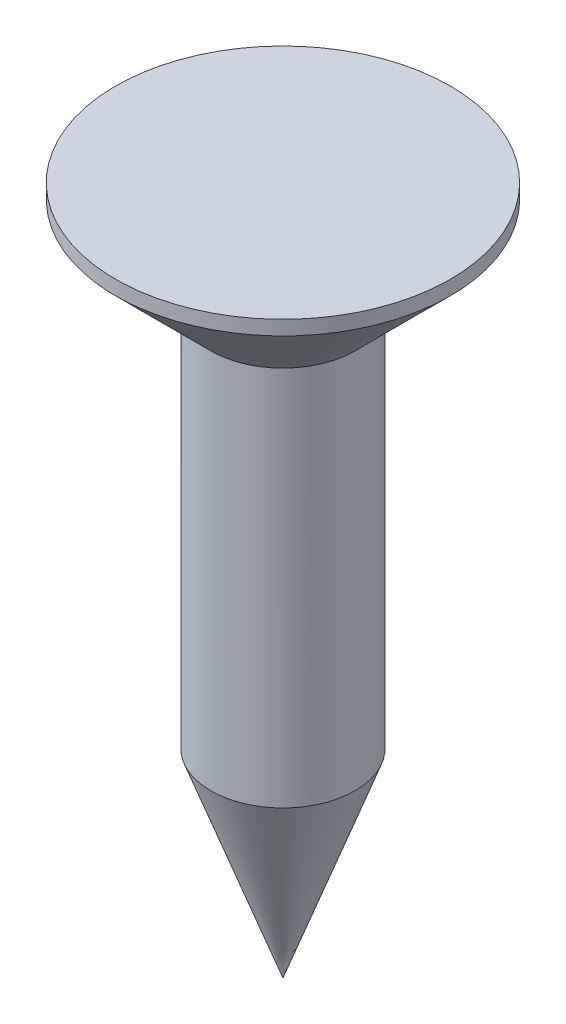
ISO-10303-21;
HEADER;
FILE_DESCRIPTION(('STEP AP214'),'2;1');
FILE_NAME('part.step','',(''),(''),'','','');
FILE_SCHEMA(('AUTOMOTIVE_DESIGN { 1 0 10303 214 1 1 1 1 }'));
ENDSEC;
DATA;
#1=APPLICATION_CONTEXT('core data for automotive mechanical design processes');
#2=APPLICATION_PROTOCOL_DEFINITION('international standard','automotive_design',2000,#1);
#3=PRODUCT_CONTEXT('',#1,'mechanical');
#4=PRODUCT('Part','Part','',(#3));
#5=PRODUCT_RELATED_PRODUCT_CATEGORY('part','',(#4));
#6=PRODUCT_DEFINITION_FORMATION('','',#4);
#7=PRODUCT_DEFINITION_CONTEXT('part definition',#1,'design');
#8=PRODUCT_DEFINITION('design','',#6,#7);
#9=PRODUCT_DEFINITION_SHAPE('','',#8);
#10=(LENGTH_UNIT() NAMED_UNIT(*) SI_UNIT(.MILLI.,.METRE.));
#11=(NAMED_UNIT(*) PLANE_ANGLE_UNIT() SI_UNIT($,.RADIAN.));
#12=(NAMED_UNIT(*) SI_UNIT($,.STERADIAN.) SOLID_ANGLE_UNIT());
#13=UNCERTAINTY_MEASURE_WITH_UNIT(LENGTH_MEASURE(1.E-05),#10,'distance_accuracy_value','');
#14=(GEOMETRIC_REPRESENTATION_CONTEXT(3) GLOBAL_UNCERTAINTY_ASSIGNED_CONTEXT((#13)) GLOBAL_UNIT_ASSIGNED_CONTEXT((#10,
#11,#12)) REPRESENTATION_CONTEXT('',''));
#15=CARTESIAN_POINT('',(0.,0.,0.));
#16=DIRECTION('',(0.,0.,1.));
#17=DIRECTION('',(1.,0.,0.));
#18=AXIS2_PLACEMENT_3D('',#15,#16,#17);
#19=CARTESIAN_POINT('',(0.,-4.25,0.));
#20=DIRECTION('',(0.,1.,0.));
#21=DIRECTION('',(0.,0.,1.));
#22=AXIS2_PLACEMENT_3D('',#19,#20,#21);
#23=CONICAL_SURFACE('',#22,1.25,0.34906585039886);
#24=CARTESIAN_POINT('',(0.,-7.68434677431834,0.));
#25=VERTEX_POINT('',#24);
#26=VERTEX_LOOP('',#25);
#27=FACE_BOUND('',#26,.T.);
#28=CARTESIAN_POINT('',(0.,-4.25,0.));
#29=DIRECTION('',(0.,-1.,0.));
#30=DIRECTION('',(0.,0.,-1.));
#31=AXIS2_PLACEMENT_3D('',#28,#29,#30);
#32=CIRCLE('',#31,1.25);
#33=CARTESIAN_POINT('',(0.,-4.25,-1.25));
#34=VERTEX_POINT('',#33);
#35=EDGE_CURVE('E11',#34,#34,#32,.T.);
#36=ORIENTED_EDGE('',*,*,#35,.T.);
#37=EDGE_LOOP('',(#36));
#38=FACE_BOUND('',#37,.T.);
#39=ADVANCED_FACE('F45',(#27,#38),#23,.T.);
#40=CARTESIAN_POINT('',(0.,-7.68434677431834,0.));
#41=DIRECTION('',(0.,-1.,0.));
#42=DIRECTION('',(0.,0.,-1.));
#43=AXIS2_PLACEMENT_3D('',#40,#41,#42);
#44=CYLINDRICAL_SURFACE('',#43,1.25);
#45=ORIENTED_EDGE('',*,*,#35,.F.);
#46=EDGE_LOOP('',(#45));
#47=FACE_BOUND('',#46,.T.);
#48=CARTESIAN_POINT('',(0.,2.35000000000002,0.));
#49=DIRECTION('',(0.,-1.,0.));
#50=DIRECTION('',(0.,0.,-1.));
#51=AXIS2_PLACEMENT_3D('',#48,#49,#50);
#52=CIRCLE('',#51,1.25);
#53=CARTESIAN_POINT('',(0.,2.35000000000002,-1.25));
#54=VERTEX_POINT('',#53);
#55=EDGE_CURVE('E52',#54,#54,#52,.T.);
#56=ORIENTED_EDGE('',*,*,#55,.T.);
#57=EDGE_LOOP('',(#56));
#58=FACE_BOUND('',#57,.T.);
#59=ADVANCED_FACE('F57',(#47,#58),#44,.T.);
#60=CARTESIAN_POINT('',(0.,4.,0.));
#61=DIRECTION('',(0.,1.,0.));
#62=DIRECTION('',(0.,0.,1.));
#63=AXIS2_PLACEMENT_3D('',#60,#61,#62);
#64=CONICAL_SURFACE('',#63,2.9,0.785398163397454);
#65=ORIENTED_EDGE('',*,*,#55,.F.);
#66=EDGE_LOOP('',(#65));
#67=FACE_BOUND('',#66,.T.);
#68=CARTESIAN_POINT('',(0.,4.,0.));
#69=DIRECTION('',(0.,-1.,0.));
#70=DIRECTION('',(0.,0.,-1.));
#71=AXIS2_PLACEMENT_3D('',#68,#69,#70);
#72=CIRCLE('',#71,2.9);
#73=CARTESIAN_POINT('',(0.,4.,-2.9));
#74=VERTEX_POINT('',#73);
#75=EDGE_CURVE('E67',#74,#74,#72,.T.);
#76=ORIENTED_EDGE('',*,*,#75,.T.);
#77=EDGE_LOOP('',(#76));
#78=FACE_BOUND('',#77,.T.);
#79=ADVANCED_FACE('F62',(#67,#78),#64,.T.);
#80=CARTESIAN_POINT('',(0.,-7.68434677431834,0.));
#81=DIRECTION('',(0.,-1.,0.));
#82=DIRECTION('',(0.,0.,-1.));
#83=AXIS2_PLACEMENT_3D('',#80,#81,#82);
#84=CYLINDRICAL_SURFACE('',#83,2.9);
#85=ORIENTED_EDGE('',*,*,#75,.F.);
#86=EDGE_LOOP('',(#85));
#87=FACE_BOUND('',#86,.T.);
#88=CARTESIAN_POINT('',(0.,4.25,0.));
#89=DIRECTION('',(0.,-1.,0.));
#90=DIRECTION('',(0.,0.,-1.));
#91=AXIS2_PLACEMENT_3D('',#88,#89,#90);
#92=CIRCLE('',#91,2.9);
#93=CARTESIAN_POINT('',(0.,4.25,-2.9));
#94=VERTEX_POINT('',#93);
#95=EDGE_CURVE('E70',#94,#94,#92,.T.);
#96=ORIENTED_EDGE('',*,*,#95,.T.);
#97=EDGE_LOOP('',(#96));
#98=FACE_BOUND('',#97,.T.);
#99=ADVANCED_FACE('F77',(#87,#98),#84,.T.);
#100=CARTESIAN_POINT('',(0.,4.25,0.));
#101=DIRECTION('',(0.,-1.,0.));
#102=DIRECTION('',(0.,0.,-1.));
#103=AXIS2_PLACEMENT_3D('',#100,#101,#102);
#104=PLANE('',#103);
#105=ORIENTED_EDGE('',*,*,#95,.F.);
#106=EDGE_LOOP('',(#105));
#107=FACE_BOUND('',#106,.T.);
#108=ADVANCED_FACE('F79',(#107),#104,.F.);
#109=CLOSED_SHELL('',(#39,#59,#79,#99,#108));
#110=MANIFOLD_SOLID_BREP('B2',#109);
#111=ADVANCED_BREP_SHAPE_REPRESENTATION('',(#18,#110),#14);
#112=SHAPE_DEFINITION_REPRESENTATION(#9,#111);
ENDSEC;
END-ISO-10303-21;
